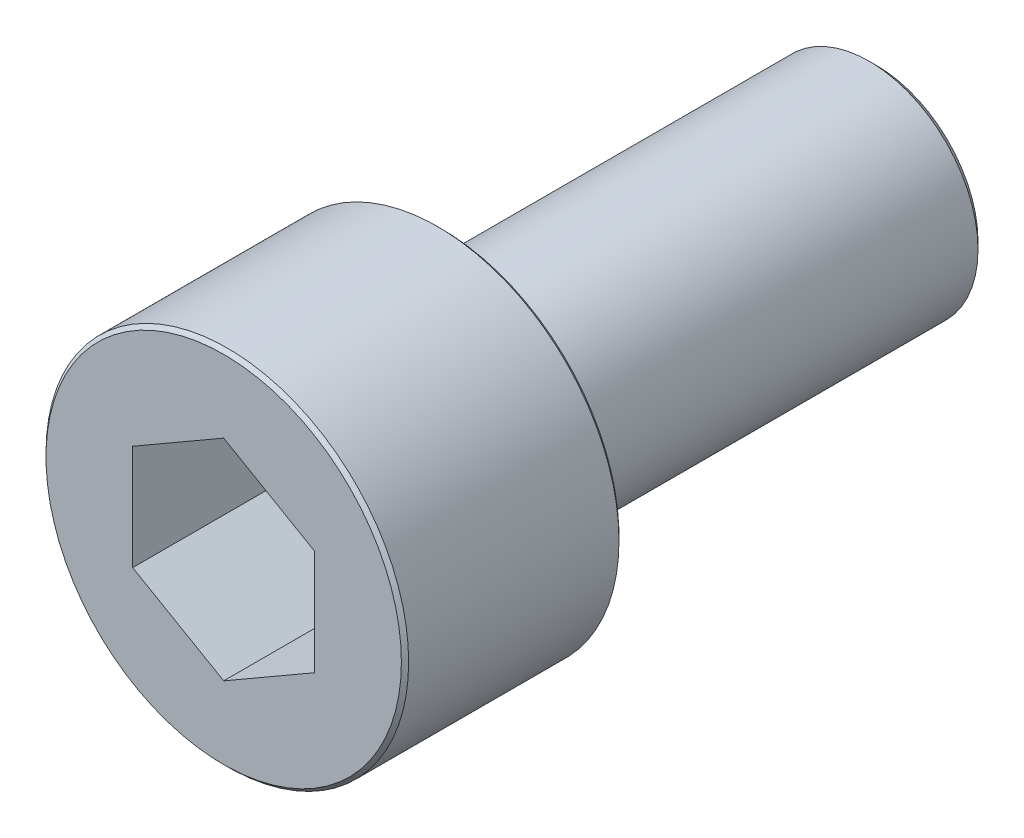
ISO-10303-21;
HEADER;
FILE_DESCRIPTION(('STEP AP214'),'2;1');
FILE_NAME('part.step','',(''),(''),'','','');
FILE_SCHEMA(('AUTOMOTIVE_DESIGN { 1 0 10303 214 1 1 1 1 }'));
ENDSEC;
DATA;
#1=APPLICATION_CONTEXT('core data for automotive mechanical design processes');
#2=APPLICATION_PROTOCOL_DEFINITION('international standard','automotive_design',2000,#1);
#3=PRODUCT_CONTEXT('',#1,'mechanical');
#4=PRODUCT('Part','Part','',(#3));
#5=PRODUCT_RELATED_PRODUCT_CATEGORY('part','',(#4));
#6=PRODUCT_DEFINITION_FORMATION('','',#4);
#7=PRODUCT_DEFINITION_CONTEXT('part definition',#1,'design');
#8=PRODUCT_DEFINITION('design','',#6,#7);
#9=PRODUCT_DEFINITION_SHAPE('','',#8);
#10=(LENGTH_UNIT() NAMED_UNIT(*) SI_UNIT(.MILLI.,.METRE.));
#11=(NAMED_UNIT(*) PLANE_ANGLE_UNIT() SI_UNIT($,.RADIAN.));
#12=(NAMED_UNIT(*) SI_UNIT($,.STERADIAN.) SOLID_ANGLE_UNIT());
#13=UNCERTAINTY_MEASURE_WITH_UNIT(LENGTH_MEASURE(1.E-05),#10,'distance_accuracy_value','');
#14=(GEOMETRIC_REPRESENTATION_CONTEXT(3) GLOBAL_UNCERTAINTY_ASSIGNED_CONTEXT((#13)) GLOBAL_UNIT_ASSIGNED_CONTEXT((#10,
#11,#12)) REPRESENTATION_CONTEXT('',''));
#15=CARTESIAN_POINT('',(0.,0.,0.));
#16=DIRECTION('',(0.,0.,1.));
#17=DIRECTION('',(1.,0.,0.));
#18=AXIS2_PLACEMENT_3D('',#15,#16,#17);
#19=CARTESIAN_POINT('',(0.,0.,12.));
#20=DIRECTION('',(0.,0.,1.));
#21=DIRECTION('',(1.,0.,0.));
#22=AXIS2_PLACEMENT_3D('',#19,#20,#21);
#23=CYLINDRICAL_SURFACE('',#22,5.);
#24=CARTESIAN_POINT('',(0.,0.,12.099999360588));
#25=DIRECTION('',(0.,0.,-1.));
#26=DIRECTION('',(-1.,0.,0.));
#27=AXIS2_PLACEMENT_3D('',#24,#25,#26);
#28=CIRCLE('',#27,5.);
#29=CARTESIAN_POINT('',(-5.,0.,12.099999360588));
#30=VERTEX_POINT('',#29);
#31=EDGE_CURVE('E153',#30,#30,#28,.F.);
#32=ORIENTED_EDGE('',*,*,#31,.T.);
#33=EDGE_LOOP('',(#32));
#34=FACE_BOUND('',#33,.T.);
#35=CARTESIAN_POINT('',(0.,0.,17.9000006868187));
#36=DIRECTION('',(0.,0.,1.));
#37=DIRECTION('',(1.,0.,0.));
#38=AXIS2_PLACEMENT_3D('',#35,#36,#37);
#39=CIRCLE('',#38,5.);
#40=CARTESIAN_POINT('',(5.,0.,17.9000006868187));
#41=VERTEX_POINT('',#40);
#42=EDGE_CURVE('E150',#41,#41,#39,.F.);
#43=ORIENTED_EDGE('',*,*,#42,.T.);
#44=EDGE_LOOP('',(#43));
#45=FACE_BOUND('',#44,.T.);
#46=ADVANCED_FACE('F39',(#34,#45),#23,.T.);
#47=CARTESIAN_POINT('',(5.,0.,12.));
#48=DIRECTION('',(0.,0.,-1.));
#49=DIRECTION('',(-1.,0.,0.));
#50=AXIS2_PLACEMENT_3D('',#47,#48,#49);
#51=PLANE('',#50);
#52=CARTESIAN_POINT('',(0.,0.,12.));
#53=DIRECTION('',(0.,0.,-1.));
#54=DIRECTION('',(-1.,0.,0.));
#55=AXIS2_PLACEMENT_3D('',#52,#53,#54);
#56=CIRCLE('',#55,4.90000068681865);
#57=CARTESIAN_POINT('',(-4.90000068681865,0.,12.));
#58=VERTEX_POINT('',#57);
#59=EDGE_CURVE('E156',#58,#58,#56,.T.);
#60=ORIENTED_EDGE('',*,*,#59,.T.);
#61=EDGE_LOOP('',(#60));
#62=FACE_BOUND('',#61,.T.);
#63=CARTESIAN_POINT('',(0.,0.,12.));
#64=DIRECTION('',(0.,0.,-1.));
#65=DIRECTION('',(-1.,0.,0.));
#66=AXIS2_PLACEMENT_3D('',#63,#64,#65);
#67=CIRCLE('',#66,3.);
#68=CARTESIAN_POINT('',(-3.,0.,12.));
#69=VERTEX_POINT('',#68);
#70=EDGE_CURVE('E142',#69,#69,#67,.T.);
#71=ORIENTED_EDGE('',*,*,#70,.F.);
#72=EDGE_LOOP('',(#71));
#73=FACE_BOUND('',#72,.T.);
#74=ADVANCED_FACE('F176',(#62,#73),#51,.T.);
#75=CARTESIAN_POINT('',(0.,0.,18.));
#76=DIRECTION('',(0.,0.,1.));
#77=DIRECTION('',(1.,0.,0.));
#78=AXIS2_PLACEMENT_3D('',#75,#76,#77);
#79=PLANE('',#78);
#80=CARTESIAN_POINT('',(0.,0.,18.));
#81=DIRECTION('',(0.,0.,1.));
#82=DIRECTION('',(1.,0.,0.));
#83=AXIS2_PLACEMENT_3D('',#80,#81,#82);
#84=CIRCLE('',#83,4.90000063941202);
#85=CARTESIAN_POINT('',(4.90000063941202,0.,18.));
#86=VERTEX_POINT('',#85);
#87=EDGE_CURVE('E159',#86,#86,#84,.T.);
#88=ORIENTED_EDGE('',*,*,#87,.T.);
#89=EDGE_LOOP('',(#88));
#90=FACE_BOUND('',#89,.T.);
#91=DIRECTION('',(0.,-1.,0.));
#92=VECTOR('',#91,1.);
#93=CARTESIAN_POINT('',(-2.51,1.449149175666,18.));
#94=LINE('',#93,#92);
#95=CARTESIAN_POINT('',(-2.51,1.449149175666,18.));
#96=VERTEX_POINT('',#95);
#97=CARTESIAN_POINT('',(-2.51,-1.449149175666,18.));
#98=VERTEX_POINT('',#97);
#99=EDGE_CURVE('E55',#96,#98,#94,.T.);
#100=ORIENTED_EDGE('',*,*,#99,.F.);
#101=DIRECTION('',(-0.866025403784431,-0.500000000000014,0.));
#102=VECTOR('',#101,1.);
#103=CARTESIAN_POINT('',(0.,2.89829835133201,18.));
#104=LINE('',#103,#102);
#105=CARTESIAN_POINT('',(0.,2.89829835133201,18.));
#106=VERTEX_POINT('',#105);
#107=EDGE_CURVE('E138',#106,#96,#104,.T.);
#108=ORIENTED_EDGE('',*,*,#107,.F.);
#109=DIRECTION('',(-0.866025403784431,0.500000000000014,0.));
#110=VECTOR('',#109,1.);
#111=CARTESIAN_POINT('',(2.51,1.449149175666,18.));
#112=LINE('',#111,#110);
#113=CARTESIAN_POINT('',(2.51,1.449149175666,18.));
#114=VERTEX_POINT('',#113);
#115=EDGE_CURVE('E136',#114,#106,#112,.T.);
#116=ORIENTED_EDGE('',*,*,#115,.F.);
#117=DIRECTION('',(0.,1.,0.));
#118=VECTOR('',#117,1.);
#119=CARTESIAN_POINT('',(2.51,-1.449149175666,18.));
#120=LINE('',#119,#118);
#121=CARTESIAN_POINT('',(2.51,-1.449149175666,18.));
#122=VERTEX_POINT('',#121);
#123=EDGE_CURVE('E103',#122,#114,#120,.T.);
#124=ORIENTED_EDGE('',*,*,#123,.F.);
#125=DIRECTION('',(0.866025403784431,0.500000000000013,0.));
#126=VECTOR('',#125,1.);
#127=CARTESIAN_POINT('',(0.,-2.898298351332,18.));
#128=LINE('',#127,#126);
#129=CARTESIAN_POINT('',(0.,-2.898298351332,18.));
#130=VERTEX_POINT('',#129);
#131=EDGE_CURVE('E132',#130,#122,#128,.T.);
#132=ORIENTED_EDGE('',*,*,#131,.F.);
#133=DIRECTION('',(0.866025403784432,-0.500000000000012,0.));
#134=VECTOR('',#133,1.);
#135=CARTESIAN_POINT('',(-2.51,-1.449149175666,18.));
#136=LINE('',#135,#134);
#137=EDGE_CURVE('E129',#98,#130,#136,.T.);
#138=ORIENTED_EDGE('',*,*,#137,.F.);
#139=EDGE_LOOP('',(#100,#108,#116,#124,#132,#138));
#140=FACE_BOUND('',#139,.T.);
#141=ADVANCED_FACE('F182',(#90,#140),#79,.T.);
#142=CARTESIAN_POINT('',(0.,0.,0.));
#143=DIRECTION('',(0.,0.,1.));
#144=DIRECTION('',(1.,0.,0.));
#145=AXIS2_PLACEMENT_3D('',#142,#143,#144);
#146=CYLINDRICAL_SURFACE('',#145,3.);
#147=CARTESIAN_POINT('',(0.,0.,0.200001377556236));
#148=DIRECTION('',(0.,0.,-1.));
#149=DIRECTION('',(-1.,0.,0.));
#150=AXIS2_PLACEMENT_3D('',#147,#148,#149);
#151=CIRCLE('',#150,3.);
#152=CARTESIAN_POINT('',(3.,0.,0.200001377556236));
#153=VERTEX_POINT('',#152);
#154=EDGE_CURVE('E11',#153,#153,#151,.F.);
#155=ORIENTED_EDGE('',*,*,#154,.T.);
#156=EDGE_LOOP('',(#155));
#157=FACE_BOUND('',#156,.T.);
#158=ORIENTED_EDGE('',*,*,#70,.T.);
#159=EDGE_LOOP('',(#158));
#160=FACE_BOUND('',#159,.T.);
#161=ADVANCED_FACE('F209',(#157,#160),#146,.T.);
#162=CARTESIAN_POINT('',(0.,0.,0.));
#163=DIRECTION('',(0.,0.,-1.));
#164=DIRECTION('',(-1.,0.,0.));
#165=AXIS2_PLACEMENT_3D('',#162,#163,#164);
#166=PLANE('',#165);
#167=CARTESIAN_POINT('',(0.,0.,0.));
#168=DIRECTION('',(0.,0.,-1.));
#169=DIRECTION('',(-1.,0.,0.));
#170=AXIS2_PLACEMENT_3D('',#167,#168,#169);
#171=CIRCLE('',#170,2.79999871447326);
#172=CARTESIAN_POINT('',(2.79999871447326,0.,0.));
#173=VERTEX_POINT('',#172);
#174=EDGE_CURVE('E48',#173,#173,#171,.T.);
#175=ORIENTED_EDGE('',*,*,#174,.T.);
#176=EDGE_LOOP('',(#175));
#177=FACE_BOUND('',#176,.T.);
#178=ADVANCED_FACE('F164',(#177),#166,.T.);
#179=CARTESIAN_POINT('',(-2.51,1.449149175666,13.5));
#180=DIRECTION('',(-1.,0.,0.));
#181=DIRECTION('',(0.,-1.,0.));
#182=AXIS2_PLACEMENT_3D('',#179,#180,#181);
#183=PLANE('',#182);
#184=ORIENTED_EDGE('',*,*,#99,.T.);
#185=DIRECTION('',(0.,0.,1.));
#186=VECTOR('',#185,1.);
#187=CARTESIAN_POINT('',(-2.51,-1.449149175666,13.5));
#188=LINE('',#187,#186);
#189=CARTESIAN_POINT('',(-2.51,-1.449149175666,13.5));
#190=VERTEX_POINT('',#189);
#191=EDGE_CURVE('E85',#190,#98,#188,.T.);
#192=ORIENTED_EDGE('',*,*,#191,.F.);
#193=DIRECTION('',(0.,-1.,0.));
#194=VECTOR('',#193,1.);
#195=CARTESIAN_POINT('',(-2.51,1.449149175666,13.5));
#196=LINE('',#195,#194);
#197=CARTESIAN_POINT('',(-2.51,1.449149175666,13.5));
#198=VERTEX_POINT('',#197);
#199=EDGE_CURVE('E140',#198,#190,#196,.T.);
#200=ORIENTED_EDGE('',*,*,#199,.F.);
#201=DIRECTION('',(0.,0.,1.));
#202=VECTOR('',#201,1.);
#203=CARTESIAN_POINT('',(-2.51,1.449149175666,13.5));
#204=LINE('',#203,#202);
#205=EDGE_CURVE('E63',#198,#96,#204,.T.);
#206=ORIENTED_EDGE('',*,*,#205,.T.);
#207=EDGE_LOOP('',(#184,#192,#200,#206));
#208=FACE_BOUND('',#207,.T.);
#209=ADVANCED_FACE('F217',(#208),#183,.F.);
#210=CARTESIAN_POINT('',(0.,2.89829835133201,13.5));
#211=DIRECTION('',(-0.500000000000014,0.866025403784431,0.));
#212=DIRECTION('',(-0.866025403784431,-0.500000000000014,0.));
#213=AXIS2_PLACEMENT_3D('',#210,#211,#212);
#214=PLANE('',#213);
#215=ORIENTED_EDGE('',*,*,#107,.T.);
#216=ORIENTED_EDGE('',*,*,#205,.F.);
#217=DIRECTION('',(-0.866025403784431,-0.500000000000014,0.));
#218=VECTOR('',#217,1.);
#219=CARTESIAN_POINT('',(0.,2.89829835133201,13.5));
#220=LINE('',#219,#218);
#221=CARTESIAN_POINT('',(0.,2.89829835133201,13.5));
#222=VERTEX_POINT('',#221);
#223=EDGE_CURVE('E115',#222,#198,#220,.T.);
#224=ORIENTED_EDGE('',*,*,#223,.F.);
#225=DIRECTION('',(0.,0.,1.));
#226=VECTOR('',#225,1.);
#227=CARTESIAN_POINT('',(0.,2.89829835133201,13.5));
#228=LINE('',#227,#226);
#229=EDGE_CURVE('E107',#222,#106,#228,.T.);
#230=ORIENTED_EDGE('',*,*,#229,.T.);
#231=EDGE_LOOP('',(#215,#216,#224,#230));
#232=FACE_BOUND('',#231,.T.);
#233=ADVANCED_FACE('F223',(#232),#214,.F.);
#234=CARTESIAN_POINT('',(2.51,1.449149175666,13.5));
#235=DIRECTION('',(0.500000000000014,0.866025403784431,0.));
#236=DIRECTION('',(-0.866025403784431,0.500000000000014,0.));
#237=AXIS2_PLACEMENT_3D('',#234,#235,#236);
#238=PLANE('',#237);
#239=ORIENTED_EDGE('',*,*,#115,.T.);
#240=ORIENTED_EDGE('',*,*,#229,.F.);
#241=DIRECTION('',(-0.866025403784431,0.500000000000014,0.));
#242=VECTOR('',#241,1.);
#243=CARTESIAN_POINT('',(2.51,1.449149175666,13.5));
#244=LINE('',#243,#242);
#245=CARTESIAN_POINT('',(2.51,1.449149175666,13.5));
#246=VERTEX_POINT('',#245);
#247=EDGE_CURVE('E111',#246,#222,#244,.T.);
#248=ORIENTED_EDGE('',*,*,#247,.F.);
#249=DIRECTION('',(0.,0.,1.));
#250=VECTOR('',#249,1.);
#251=CARTESIAN_POINT('',(2.51,1.449149175666,13.5));
#252=LINE('',#251,#250);
#253=EDGE_CURVE('E96',#246,#114,#252,.T.);
#254=ORIENTED_EDGE('',*,*,#253,.T.);
#255=EDGE_LOOP('',(#239,#240,#248,#254));
#256=FACE_BOUND('',#255,.T.);
#257=ADVANCED_FACE('F112',(#256),#238,.F.);
#258=CARTESIAN_POINT('',(2.51,-1.449149175666,13.5));
#259=DIRECTION('',(1.,0.,0.));
#260=DIRECTION('',(0.,1.,0.));
#261=AXIS2_PLACEMENT_3D('',#258,#259,#260);
#262=PLANE('',#261);
#263=ORIENTED_EDGE('',*,*,#123,.T.);
#264=ORIENTED_EDGE('',*,*,#253,.F.);
#265=DIRECTION('',(0.,1.,0.));
#266=VECTOR('',#265,1.);
#267=CARTESIAN_POINT('',(2.51,-1.449149175666,13.5));
#268=LINE('',#267,#266);
#269=CARTESIAN_POINT('',(2.51,-1.449149175666,13.5));
#270=VERTEX_POINT('',#269);
#271=EDGE_CURVE('E100',#270,#246,#268,.T.);
#272=ORIENTED_EDGE('',*,*,#271,.F.);
#273=DIRECTION('',(0.,0.,1.));
#274=VECTOR('',#273,1.);
#275=CARTESIAN_POINT('',(2.51,-1.449149175666,13.5));
#276=LINE('',#275,#274);
#277=EDGE_CURVE('E108',#270,#122,#276,.T.);
#278=ORIENTED_EDGE('',*,*,#277,.T.);
#279=EDGE_LOOP('',(#263,#264,#272,#278));
#280=FACE_BOUND('',#279,.T.);
#281=ADVANCED_FACE('F98',(#280),#262,.F.);
#282=CARTESIAN_POINT('',(0.,-2.898298351332,13.5));
#283=DIRECTION('',(0.500000000000013,-0.866025403784431,0.));
#284=DIRECTION('',(0.866025403784431,0.500000000000013,0.));
#285=AXIS2_PLACEMENT_3D('',#282,#283,#284);
#286=PLANE('',#285);
#287=ORIENTED_EDGE('',*,*,#131,.T.);
#288=ORIENTED_EDGE('',*,*,#277,.F.);
#289=DIRECTION('',(0.866025403784431,0.500000000000013,0.));
#290=VECTOR('',#289,1.);
#291=CARTESIAN_POINT('',(0.,-2.898298351332,13.5));
#292=LINE('',#291,#290);
#293=CARTESIAN_POINT('',(0.,-2.898298351332,13.5));
#294=VERTEX_POINT('',#293);
#295=EDGE_CURVE('E121',#294,#270,#292,.T.);
#296=ORIENTED_EDGE('',*,*,#295,.F.);
#297=DIRECTION('',(0.,0.,1.));
#298=VECTOR('',#297,1.);
#299=CARTESIAN_POINT('',(0.,-2.898298351332,13.5));
#300=LINE('',#299,#298);
#301=EDGE_CURVE('E145',#294,#130,#300,.T.);
#302=ORIENTED_EDGE('',*,*,#301,.T.);
#303=EDGE_LOOP('',(#287,#288,#296,#302));
#304=FACE_BOUND('',#303,.T.);
#305=ADVANCED_FACE('F226',(#304),#286,.F.);
#306=CARTESIAN_POINT('',(-2.51,-1.449149175666,13.5));
#307=DIRECTION('',(-0.500000000000012,-0.866025403784432,0.));
#308=DIRECTION('',(0.866025403784432,-0.500000000000012,0.));
#309=AXIS2_PLACEMENT_3D('',#306,#307,#308);
#310=PLANE('',#309);
#311=ORIENTED_EDGE('',*,*,#137,.T.);
#312=ORIENTED_EDGE('',*,*,#301,.F.);
#313=DIRECTION('',(0.866025403784432,-0.500000000000012,0.));
#314=VECTOR('',#313,1.);
#315=CARTESIAN_POINT('',(-2.51,-1.449149175666,13.5));
#316=LINE('',#315,#314);
#317=EDGE_CURVE('E123',#190,#294,#316,.T.);
#318=ORIENTED_EDGE('',*,*,#317,.F.);
#319=ORIENTED_EDGE('',*,*,#191,.T.);
#320=EDGE_LOOP('',(#311,#312,#318,#319));
#321=FACE_BOUND('',#320,.T.);
#322=ADVANCED_FACE('F201',(#321),#310,.F.);
#323=CARTESIAN_POINT('',(0.,0.,13.5));
#324=DIRECTION('',(0.,0.,1.));
#325=DIRECTION('',(1.,0.,0.));
#326=AXIS2_PLACEMENT_3D('',#323,#324,#325);
#327=PLANE('',#326);
#328=ORIENTED_EDGE('',*,*,#199,.T.);
#329=ORIENTED_EDGE('',*,*,#317,.T.);
#330=ORIENTED_EDGE('',*,*,#295,.T.);
#331=ORIENTED_EDGE('',*,*,#271,.T.);
#332=ORIENTED_EDGE('',*,*,#247,.T.);
#333=ORIENTED_EDGE('',*,*,#223,.T.);
#334=EDGE_LOOP('',(#328,#329,#330,#331,#332,#333));
#335=FACE_BOUND('',#334,.T.);
#336=ADVANCED_FACE('F118',(#335),#327,.T.);
#337=CARTESIAN_POINT('',(0.,0.,12.099999360588));
#338=DIRECTION('',(0.,0.,1.));
#339=DIRECTION('',(1.,0.,0.));
#340=AXIS2_PLACEMENT_3D('',#337,#338,#339);
#341=CONICAL_SURFACE('',#340,5.,0.785397926362736);
#342=ORIENTED_EDGE('',*,*,#59,.F.);
#343=EDGE_LOOP('',(#342));
#344=FACE_BOUND('',#343,.T.);
#345=ORIENTED_EDGE('',*,*,#31,.F.);
#346=EDGE_LOOP('',(#345));
#347=FACE_BOUND('',#346,.T.);
#348=ADVANCED_FACE('F172',(#344,#347),#341,.T.);
#349=CARTESIAN_POINT('',(0.,0.,18.));
#350=DIRECTION('',(0.,0.,-1.));
#351=DIRECTION('',(-1.,0.,0.));
#352=AXIS2_PLACEMENT_3D('',#349,#350,#351);
#353=CONICAL_SURFACE('',#352,4.90000063941202,0.785398400432169);
#354=ORIENTED_EDGE('',*,*,#42,.F.);
#355=EDGE_LOOP('',(#354));
#356=FACE_BOUND('',#355,.T.);
#357=ORIENTED_EDGE('',*,*,#87,.F.);
#358=EDGE_LOOP('',(#357));
#359=FACE_BOUND('',#358,.T.);
#360=ADVANCED_FACE('F167',(#356,#359),#353,.T.);
#361=CARTESIAN_POINT('',(0.,0.,0.));
#362=DIRECTION('',(0.,0.,1.));
#363=DIRECTION('',(1.,0.,0.));
#364=AXIS2_PLACEMENT_3D('',#361,#362,#363);
#365=CONICAL_SURFACE('',#364,2.79999871447326,0.78539793332524);
#366=CARTESIAN_POINT('',(3.,0.,0.200001377556236));
#367=CARTESIAN_POINT('',(2.99791665327576,0.,0.197918029873359));
#368=CARTESIAN_POINT('',(2.99583330655153,0.,0.195834682190481));
#369=CARTESIAN_POINT('',(2.99166661310305,0.,0.191667986824726));
#370=CARTESIAN_POINT('',(2.98958326637882,0.,0.189584639141849));
#371=CARTESIAN_POINT('',(2.98541657293034,0.,0.185417943776094));
#372=CARTESIAN_POINT('',(2.98333322620611,0.,0.183334596093217));
#373=CARTESIAN_POINT('',(2.97916653275763,0.,0.179167900727462));
#374=CARTESIAN_POINT('',(2.97708318603339,0.,0.177084553044584));
#375=CARTESIAN_POINT('',(2.97291649258492,0.,0.172917857678829));
#376=CARTESIAN_POINT('',(2.97083314586068,0.,0.170834509995952));
#377=CARTESIAN_POINT('',(2.96666645241221,0.,0.166667814630197));
#378=CARTESIAN_POINT('',(2.96458310568797,0.,0.164584466947319));
#379=CARTESIAN_POINT('',(2.9604164122395,0.,0.160417771581565));
#380=CARTESIAN_POINT('',(2.95833306551526,0.,0.158334423898687));
#381=CARTESIAN_POINT('',(2.95416637206679,0.,0.154167728532932));
#382=CARTESIAN_POINT('',(2.95208302534255,0.,0.152084380850055));
#383=CARTESIAN_POINT('',(2.94791633189408,0.,0.1479176854843));
#384=CARTESIAN_POINT('',(2.94583298516984,0.,0.145834337801422));
#385=CARTESIAN_POINT('',(2.94166629172137,0.,0.141667642435667));
#386=CARTESIAN_POINT('',(2.93958294499713,0.,0.13958429475279));
#387=CARTESIAN_POINT('',(2.93541625154866,0.,0.135417599387035));
#388=CARTESIAN_POINT('',(2.93333290482442,0.,0.133334251704157));
#389=CARTESIAN_POINT('',(2.92916621137595,0.,0.129167556338403));
#390=CARTESIAN_POINT('',(2.92708286465171,0.,0.127084208655525));
#391=CARTESIAN_POINT('',(2.92291617120324,0.,0.12291751328977));
#392=CARTESIAN_POINT('',(2.920832824479,0.,0.120834165606893));
#393=CARTESIAN_POINT('',(2.91666613103052,0.,0.116667470241138));
#394=CARTESIAN_POINT('',(2.91458278430629,0.,0.11458412255826));
#395=CARTESIAN_POINT('',(2.91041609085781,0.,0.110417427192505));
#396=CARTESIAN_POINT('',(2.90833274413358,0.,0.108334079509628));
#397=CARTESIAN_POINT('',(2.9041660506851,0.,0.104167384143873));
#398=CARTESIAN_POINT('',(2.90208270396087,0.,0.102084036460996));
#399=CARTESIAN_POINT('',(2.89791601051239,0.,0.0979173410952407));
#400=CARTESIAN_POINT('',(2.89583266378816,0.,0.0958339934123632));
#401=CARTESIAN_POINT('',(2.89166597033968,0.,0.0916672980466083));
#402=CARTESIAN_POINT('',(2.88958262361545,0.,0.0895839503637308));
#403=CARTESIAN_POINT('',(2.88541593016697,0.,0.0854172549979759));
#404=CARTESIAN_POINT('',(2.88333258344273,0.,0.0833339073150985));
#405=CARTESIAN_POINT('',(2.87916588999426,0.,0.0791672119493436));
#406=CARTESIAN_POINT('',(2.87708254327002,0.,0.077083864266466));
#407=CARTESIAN_POINT('',(2.87291584982155,0.,0.0729171689007111));
#408=CARTESIAN_POINT('',(2.87083250309731,0.,0.0708338212178337));
#409=CARTESIAN_POINT('',(2.86666580964884,0.,0.0666671258520788));
#410=CARTESIAN_POINT('',(2.8645824629246,0.,0.0645837781692013));
#411=CARTESIAN_POINT('',(2.86041576947613,0.,0.0604170828034464));
#412=CARTESIAN_POINT('',(2.85833242275189,0.,0.058333735120569));
#413=CARTESIAN_POINT('',(2.85416572930342,0.,0.054167039754814));
#414=CARTESIAN_POINT('',(2.85208238257918,0.,0.0520836920719365));
#415=CARTESIAN_POINT('',(2.84791568913071,0.,0.0479169967061815));
#416=CARTESIAN_POINT('',(2.84583234240647,0.,0.0458336490233041));
#417=CARTESIAN_POINT('',(2.841665648958,0.,0.0416669536575492));
#418=CARTESIAN_POINT('',(2.83958230223376,0.,0.0395836059746718));
#419=CARTESIAN_POINT('',(2.83541560878529,0.,0.0354169106089169));
#420=CARTESIAN_POINT('',(2.83333226206105,0.,0.0333335629260393));
#421=CARTESIAN_POINT('',(2.82916556861258,0.,0.0291668675602844));
#422=CARTESIAN_POINT('',(2.82708222188834,0.,0.027083519877407));
#423=CARTESIAN_POINT('',(2.82291552843987,0.,0.0229168245116521));
#424=CARTESIAN_POINT('',(2.82083218171563,0.,0.0208334768287746));
#425=CARTESIAN_POINT('',(2.81666548826715,0.,0.0166667814630196));
#426=CARTESIAN_POINT('',(2.81458214154292,0.,0.0145834337801423));
#427=CARTESIAN_POINT('',(2.81041544809444,0.,0.0104167384143874));
#428=CARTESIAN_POINT('',(2.80833210137021,0.,0.00833339073150985));
#429=CARTESIAN_POINT('',(2.80416540792173,0.,0.00416669536575484));
#430=CARTESIAN_POINT('',(2.8020820611975,0.,0.00208334768287734));
#431=CARTESIAN_POINT('',(2.79999871447326,0.,0.));
#432=B_SPLINE_CURVE_WITH_KNOTS('',3,(#366,#367,#368,#369,#370,#371,#372,#373,#374,#375,#376,
#377,#378,#379,#380,#381,#382,#383,#384,#385,#386,#387,#388,#389,#390,#391,#392,#393,#394,#395,
#396,#397,#398,#399,#400,#401,#402,#403,#404,#405,#406,#407,#408,#409,#410,#411,#412,#413,#414,
#415,#416,#417,#418,#419,#420,#421,#422,#423,#424,#425,#426,#427,#428,#429,#430,#431),
.UNSPECIFIED.,.F.,.F.,(4,2,2,2,2,2,2,2,2,2,2,2,2,2,2,2,2,2,2,2,2,2,2,2,2,2,2,2,2,2,2,2,4),(0.,
0.00883889361120789,0.0176777872224161,0.026516680833624,0.0353555744448322,0.0441944680560404,
0.0530333616672483,0.0618722552784565,0.0707111488896644,0.0795500425008726,0.0883889361120808,
0.0972278297232887,0.106066723334497,0.114905616945705,0.123744510556913,0.132583404168121,
0.141422297779329,0.150261191390537,0.159100085001745,0.167938978612953,0.176777872224161,
0.185616765835369,0.194455659446577,0.203294553057786,0.212133446668993,0.220972340280202,
0.22981123389141,0.238650127502618,0.247489021113826,0.256327914725034,0.265166808336242,
0.27400570194745,0.282844595558658),.UNSPECIFIED.);
#433=EDGE_CURVE('BSEAM42',#153,#173,#432,.T.);
#434=ORIENTED_EDGE('',*,*,#154,.F.);
#435=ORIENTED_EDGE('',*,*,#174,.F.);
#436=ORIENTED_EDGE('',*,*,#433,.T.);
#437=ORIENTED_EDGE('',*,*,#433,.F.);
#438=EDGE_LOOP('',(#434,#436,#435,#437));
#439=FACE_BOUND('',#438,.T.);
#440=ADVANCED_FACE('F42',(#439),#365,.T.);
#441=CLOSED_SHELL('',(#46,#74,#141,#161,#178,#209,#233,#257,#281,#305,#322,#336,#348,#360,#440));
#442=MANIFOLD_SOLID_BREP('B2',#441);
#443=ADVANCED_BREP_SHAPE_REPRESENTATION('',(#18,#442),#14);
#444=SHAPE_DEFINITION_REPRESENTATION(#9,#443);
ENDSEC;
END-ISO-10303-21;
